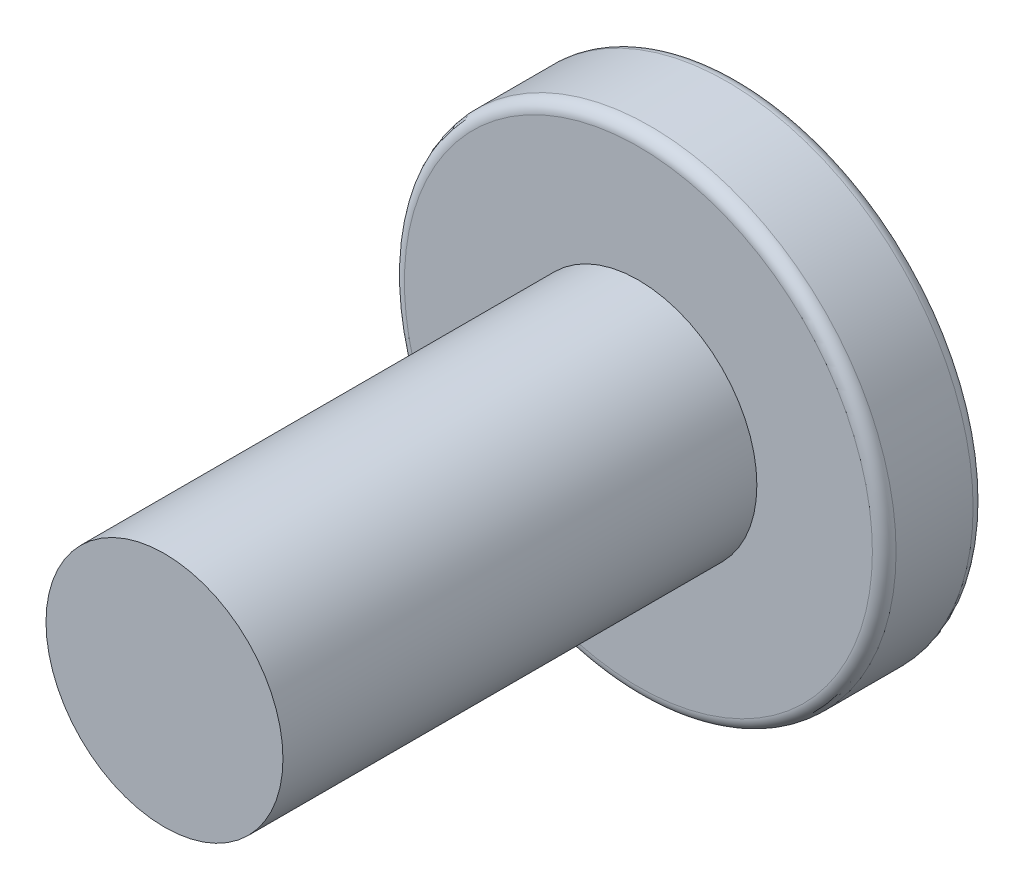
ISO-10303-21;
HEADER;
FILE_DESCRIPTION(('STEP AP214'),'2;1');
FILE_NAME('part.step','',(''),(''),'','','');
FILE_SCHEMA(('AUTOMOTIVE_DESIGN { 1 0 10303 214 1 1 1 1 }'));
ENDSEC;
DATA;
#1=APPLICATION_CONTEXT('core data for automotive mechanical design processes');
#2=APPLICATION_PROTOCOL_DEFINITION('international standard','automotive_design',2000,#1);
#3=PRODUCT_CONTEXT('',#1,'mechanical');
#4=PRODUCT('Part','Part','',(#3));
#5=PRODUCT_RELATED_PRODUCT_CATEGORY('part','',(#4));
#6=PRODUCT_DEFINITION_FORMATION('','',#4);
#7=PRODUCT_DEFINITION_CONTEXT('part definition',#1,'design');
#8=PRODUCT_DEFINITION('design','',#6,#7);
#9=PRODUCT_DEFINITION_SHAPE('','',#8);
#10=(LENGTH_UNIT() NAMED_UNIT(*) SI_UNIT(.MILLI.,.METRE.));
#11=(NAMED_UNIT(*) PLANE_ANGLE_UNIT() SI_UNIT($,.RADIAN.));
#12=(NAMED_UNIT(*) SI_UNIT($,.STERADIAN.) SOLID_ANGLE_UNIT());
#13=UNCERTAINTY_MEASURE_WITH_UNIT(LENGTH_MEASURE(1.E-05),#10,'distance_accuracy_value','');
#14=(GEOMETRIC_REPRESENTATION_CONTEXT(3) GLOBAL_UNCERTAINTY_ASSIGNED_CONTEXT((#13)) GLOBAL_UNIT_ASSIGNED_CONTEXT((#10,
#11,#12)) REPRESENTATION_CONTEXT('',''));
#15=CARTESIAN_POINT('',(0.,0.,0.));
#16=DIRECTION('',(0.,0.,1.));
#17=DIRECTION('',(1.,0.,0.));
#18=AXIS2_PLACEMENT_3D('',#15,#16,#17);
#19=CARTESIAN_POINT('',(0.,0.,1.7));
#20=DIRECTION('',(0.,0.,-1.));
#21=DIRECTION('',(-1.,0.,0.));
#22=AXIS2_PLACEMENT_3D('',#19,#20,#21);
#23=CYLINDRICAL_SURFACE('',#22,4.15);
#24=CARTESIAN_POINT('',(0.,0.,0.2));
#25=DIRECTION('',(0.,0.,1.));
#26=DIRECTION('',(1.,0.,0.));
#27=AXIS2_PLACEMENT_3D('',#24,#25,#26);
#28=CIRCLE('',#27,4.15);
#29=CARTESIAN_POINT('',(4.15,0.,0.2));
#30=VERTEX_POINT('',#29);
#31=EDGE_CURVE('E156',#30,#30,#28,.T.);
#32=ORIENTED_EDGE('',*,*,#31,.T.);
#33=EDGE_LOOP('',(#32));
#34=FACE_BOUND('',#33,.T.);
#35=CARTESIAN_POINT('',(0.,0.,1.5));
#36=DIRECTION('',(0.,0.,1.));
#37=DIRECTION('',(1.,0.,0.));
#38=AXIS2_PLACEMENT_3D('',#35,#36,#37);
#39=CIRCLE('',#38,4.15);
#40=CARTESIAN_POINT('',(4.15,0.,1.5));
#41=VERTEX_POINT('',#40);
#42=EDGE_CURVE('E153',#41,#41,#39,.F.);
#43=ORIENTED_EDGE('',*,*,#42,.T.);
#44=EDGE_LOOP('',(#43));
#45=FACE_BOUND('',#44,.T.);
#46=ADVANCED_FACE('F40',(#34,#45),#23,.T.);
#47=CARTESIAN_POINT('',(0.,0.,1.7));
#48=DIRECTION('',(0.,0.,1.));
#49=DIRECTION('',(1.,0.,0.));
#50=AXIS2_PLACEMENT_3D('',#47,#48,#49);
#51=PLANE('',#50);
#52=CARTESIAN_POINT('',(0.,0.,1.7));
#53=DIRECTION('',(0.,0.,1.));
#54=DIRECTION('',(1.,0.,0.));
#55=AXIS2_PLACEMENT_3D('',#52,#53,#54);
#56=CIRCLE('',#55,3.95);
#57=CARTESIAN_POINT('',(3.95,0.,1.7));
#58=VERTEX_POINT('',#57);
#59=EDGE_CURVE('E11',#58,#58,#56,.T.);
#60=ORIENTED_EDGE('',*,*,#59,.T.);
#61=EDGE_LOOP('',(#60));
#62=FACE_BOUND('',#61,.T.);
#63=CARTESIAN_POINT('',(0.,0.,1.7));
#64=DIRECTION('',(0.,0.,1.));
#65=DIRECTION('',(1.,0.,0.));
#66=AXIS2_PLACEMENT_3D('',#63,#64,#65);
#67=CIRCLE('',#66,2.);
#68=CARTESIAN_POINT('',(2.,0.,1.7));
#69=VERTEX_POINT('',#68);
#70=EDGE_CURVE('E150',#69,#69,#67,.T.);
#71=ORIENTED_EDGE('',*,*,#70,.F.);
#72=EDGE_LOOP('',(#71));
#73=FACE_BOUND('',#72,.T.);
#74=ADVANCED_FACE('F171',(#62,#73),#51,.T.);
#75=CARTESIAN_POINT('',(0.,0.,0.));
#76=DIRECTION('',(0.,0.,1.));
#77=DIRECTION('',(1.,0.,0.));
#78=AXIS2_PLACEMENT_3D('',#75,#76,#77);
#79=PLANE('',#78);
#80=DIRECTION('',(0.5,0.866025403784438,0.));
#81=VECTOR('',#80,1.);
#82=CARTESIAN_POINT('',(-1.15470053837925,0.,0.));
#83=LINE('',#82,#81);
#84=CARTESIAN_POINT('',(-1.15470053837925,0.,0.));
#85=VERTEX_POINT('',#84);
#86=CARTESIAN_POINT('',(-0.577350269189626,1.,0.));
#87=VERTEX_POINT('',#86);
#88=EDGE_CURVE('E129',#85,#87,#83,.T.);
#89=ORIENTED_EDGE('',*,*,#88,.F.);
#90=DIRECTION('',(-0.5,0.866025403784439,0.));
#91=VECTOR('',#90,1.);
#92=CARTESIAN_POINT('',(-0.577350269189626,-1.,0.));
#93=LINE('',#92,#91);
#94=CARTESIAN_POINT('',(-0.577350269189626,-1.,0.));
#95=VERTEX_POINT('',#94);
#96=EDGE_CURVE('E55',#95,#85,#93,.T.);
#97=ORIENTED_EDGE('',*,*,#96,.F.);
#98=DIRECTION('',(-1.,0.,0.));
#99=VECTOR('',#98,1.);
#100=CARTESIAN_POINT('',(0.577350269189626,-1.,0.));
#101=LINE('',#100,#99);
#102=CARTESIAN_POINT('',(0.577350269189626,-1.,0.));
#103=VERTEX_POINT('',#102);
#104=EDGE_CURVE('E138',#103,#95,#101,.T.);
#105=ORIENTED_EDGE('',*,*,#104,.F.);
#106=DIRECTION('',(-0.5,-0.866025403784438,0.));
#107=VECTOR('',#106,1.);
#108=CARTESIAN_POINT('',(1.15470053837925,0.,0.));
#109=LINE('',#108,#107);
#110=CARTESIAN_POINT('',(1.15470053837925,0.,0.));
#111=VERTEX_POINT('',#110);
#112=EDGE_CURVE('E136',#111,#103,#109,.T.);
#113=ORIENTED_EDGE('',*,*,#112,.F.);
#114=DIRECTION('',(0.5,-0.866025403784439,0.));
#115=VECTOR('',#114,1.);
#116=CARTESIAN_POINT('',(0.577350269189626,1.,0.));
#117=LINE('',#116,#115);
#118=CARTESIAN_POINT('',(0.577350269189626,1.,0.));
#119=VERTEX_POINT('',#118);
#120=EDGE_CURVE('E103',#119,#111,#117,.T.);
#121=ORIENTED_EDGE('',*,*,#120,.F.);
#122=DIRECTION('',(1.,0.,0.));
#123=VECTOR('',#122,1.);
#124=CARTESIAN_POINT('',(-0.577350269189626,1.,0.));
#125=LINE('',#124,#123);
#126=EDGE_CURVE('E132',#87,#119,#125,.T.);
#127=ORIENTED_EDGE('',*,*,#126,.F.);
#128=EDGE_LOOP('',(#89,#97,#105,#113,#121,#127));
#129=FACE_BOUND('',#128,.T.);
#130=CARTESIAN_POINT('',(0.,0.,0.));
#131=DIRECTION('',(0.,0.,1.));
#132=DIRECTION('',(1.,0.,0.));
#133=AXIS2_PLACEMENT_3D('',#130,#131,#132);
#134=CIRCLE('',#133,3.95);
#135=CARTESIAN_POINT('',(3.95,0.,0.));
#136=VERTEX_POINT('',#135);
#137=EDGE_CURVE('E48',#136,#136,#134,.F.);
#138=ORIENTED_EDGE('',*,*,#137,.T.);
#139=EDGE_LOOP('',(#138));
#140=FACE_BOUND('',#139,.T.);
#141=ADVANCED_FACE('F161',(#129,#140),#79,.F.);
#142=CARTESIAN_POINT('',(0.,0.,9.7));
#143=DIRECTION('',(0.,0.,-1.));
#144=DIRECTION('',(-1.,0.,0.));
#145=AXIS2_PLACEMENT_3D('',#142,#143,#144);
#146=CYLINDRICAL_SURFACE('',#145,2.);
#147=CARTESIAN_POINT('',(0.,0.,9.7));
#148=DIRECTION('',(0.,0.,1.));
#149=DIRECTION('',(1.,0.,0.));
#150=AXIS2_PLACEMENT_3D('',#147,#148,#149);
#151=CIRCLE('',#150,2.);
#152=CARTESIAN_POINT('',(2.,0.,9.7));
#153=VERTEX_POINT('',#152);
#154=EDGE_CURVE('E142',#153,#153,#151,.T.);
#155=ORIENTED_EDGE('',*,*,#154,.F.);
#156=EDGE_LOOP('',(#155));
#157=FACE_BOUND('',#156,.T.);
#158=ORIENTED_EDGE('',*,*,#70,.T.);
#159=EDGE_LOOP('',(#158));
#160=FACE_BOUND('',#159,.T.);
#161=ADVANCED_FACE('F185',(#157,#160),#146,.T.);
#162=CARTESIAN_POINT('',(0.,0.,9.7));
#163=DIRECTION('',(0.,0.,1.));
#164=DIRECTION('',(1.,0.,0.));
#165=AXIS2_PLACEMENT_3D('',#162,#163,#164);
#166=PLANE('',#165);
#167=ORIENTED_EDGE('',*,*,#154,.T.);
#168=EDGE_LOOP('',(#167));
#169=FACE_BOUND('',#168,.T.);
#170=ADVANCED_FACE('F166',(#169),#166,.T.);
#171=CARTESIAN_POINT('',(0.,0.,0.2));
#172=DIRECTION('',(0.,0.,1.));
#173=DIRECTION('',(1.,0.,0.));
#174=AXIS2_PLACEMENT_3D('',#171,#172,#173);
#175=TOROIDAL_SURFACE('',#174,3.95,0.2);
#176=ORIENTED_EDGE('',*,*,#137,.F.);
#177=EDGE_LOOP('',(#176));
#178=FACE_BOUND('',#177,.T.);
#179=ORIENTED_EDGE('',*,*,#31,.F.);
#180=EDGE_LOOP('',(#179));
#181=FACE_BOUND('',#180,.T.);
#182=ADVANCED_FACE('F163',(#178,#181),#175,.T.);
#183=CARTESIAN_POINT('',(0.,0.,1.5));
#184=DIRECTION('',(0.,0.,1.));
#185=DIRECTION('',(1.,0.,0.));
#186=AXIS2_PLACEMENT_3D('',#183,#184,#185);
#187=TOROIDAL_SURFACE('',#186,3.95,0.2);
#188=ORIENTED_EDGE('',*,*,#42,.F.);
#189=EDGE_LOOP('',(#188));
#190=FACE_BOUND('',#189,.T.);
#191=ORIENTED_EDGE('',*,*,#59,.F.);
#192=EDGE_LOOP('',(#191));
#193=FACE_BOUND('',#192,.T.);
#194=ADVANCED_FACE('F42',(#190,#193),#187,.T.);
#195=CARTESIAN_POINT('',(-0.577350269189626,-1.,1.5));
#196=DIRECTION('',(-0.866025403784439,-0.5,0.));
#197=DIRECTION('',(0.5,-0.866025403784439,0.));
#198=AXIS2_PLACEMENT_3D('',#195,#196,#197);
#199=PLANE('',#198);
#200=ORIENTED_EDGE('',*,*,#96,.T.);
#201=DIRECTION('',(0.,0.,-1.));
#202=VECTOR('',#201,1.);
#203=CARTESIAN_POINT('',(-1.15470053837925,0.,1.5));
#204=LINE('',#203,#202);
#205=CARTESIAN_POINT('',(-1.15470053837925,0.,1.5));
#206=VERTEX_POINT('',#205);
#207=EDGE_CURVE('E85',#206,#85,#204,.T.);
#208=ORIENTED_EDGE('',*,*,#207,.F.);
#209=DIRECTION('',(-0.5,0.866025403784439,0.));
#210=VECTOR('',#209,1.);
#211=CARTESIAN_POINT('',(-0.577350269189626,-1.,1.5));
#212=LINE('',#211,#210);
#213=CARTESIAN_POINT('',(-0.577350269189626,-1.,1.5));
#214=VERTEX_POINT('',#213);
#215=EDGE_CURVE('E140',#214,#206,#212,.T.);
#216=ORIENTED_EDGE('',*,*,#215,.F.);
#217=DIRECTION('',(0.,0.,-1.));
#218=VECTOR('',#217,1.);
#219=CARTESIAN_POINT('',(-0.577350269189626,-1.,1.5));
#220=LINE('',#219,#218);
#221=EDGE_CURVE('E63',#214,#95,#220,.T.);
#222=ORIENTED_EDGE('',*,*,#221,.T.);
#223=EDGE_LOOP('',(#200,#208,#216,#222));
#224=FACE_BOUND('',#223,.T.);
#225=ADVANCED_FACE('F177',(#224),#199,.F.);
#226=CARTESIAN_POINT('',(0.577350269189626,-1.,1.5));
#227=DIRECTION('',(0.,-1.,0.));
#228=DIRECTION('',(0.,0.,-1.));
#229=AXIS2_PLACEMENT_3D('',#226,#227,#228);
#230=PLANE('',#229);
#231=ORIENTED_EDGE('',*,*,#104,.T.);
#232=ORIENTED_EDGE('',*,*,#221,.F.);
#233=DIRECTION('',(-1.,0.,0.));
#234=VECTOR('',#233,1.);
#235=CARTESIAN_POINT('',(0.577350269189626,-1.,1.5));
#236=LINE('',#235,#234);
#237=CARTESIAN_POINT('',(0.577350269189626,-1.,1.5));
#238=VERTEX_POINT('',#237);
#239=EDGE_CURVE('E115',#238,#214,#236,.T.);
#240=ORIENTED_EDGE('',*,*,#239,.F.);
#241=DIRECTION('',(0.,0.,-1.));
#242=VECTOR('',#241,1.);
#243=CARTESIAN_POINT('',(0.577350269189626,-1.,1.5));
#244=LINE('',#243,#242);
#245=EDGE_CURVE('E107',#238,#103,#244,.T.);
#246=ORIENTED_EDGE('',*,*,#245,.T.);
#247=EDGE_LOOP('',(#231,#232,#240,#246));
#248=FACE_BOUND('',#247,.T.);
#249=ADVANCED_FACE('F201',(#248),#230,.F.);
#250=CARTESIAN_POINT('',(1.15470053837925,0.,1.5));
#251=DIRECTION('',(0.866025403784439,-0.5,0.));
#252=DIRECTION('',(0.5,0.866025403784439,0.));
#253=AXIS2_PLACEMENT_3D('',#250,#251,#252);
#254=PLANE('',#253);
#255=ORIENTED_EDGE('',*,*,#112,.T.);
#256=ORIENTED_EDGE('',*,*,#245,.F.);
#257=DIRECTION('',(-0.5,-0.866025403784438,0.));
#258=VECTOR('',#257,1.);
#259=CARTESIAN_POINT('',(1.15470053837925,0.,1.5));
#260=LINE('',#259,#258);
#261=CARTESIAN_POINT('',(1.15470053837925,0.,1.5));
#262=VERTEX_POINT('',#261);
#263=EDGE_CURVE('E111',#262,#238,#260,.T.);
#264=ORIENTED_EDGE('',*,*,#263,.F.);
#265=DIRECTION('',(0.,0.,-1.));
#266=VECTOR('',#265,1.);
#267=CARTESIAN_POINT('',(1.15470053837925,0.,1.5));
#268=LINE('',#267,#266);
#269=EDGE_CURVE('E96',#262,#111,#268,.T.);
#270=ORIENTED_EDGE('',*,*,#269,.T.);
#271=EDGE_LOOP('',(#255,#256,#264,#270));
#272=FACE_BOUND('',#271,.T.);
#273=ADVANCED_FACE('F112',(#272),#254,.F.);
#274=CARTESIAN_POINT('',(0.577350269189626,1.,1.5));
#275=DIRECTION('',(0.866025403784439,0.5,0.));
#276=DIRECTION('',(-0.5,0.866025403784439,0.));
#277=AXIS2_PLACEMENT_3D('',#274,#275,#276);
#278=PLANE('',#277);
#279=ORIENTED_EDGE('',*,*,#120,.T.);
#280=ORIENTED_EDGE('',*,*,#269,.F.);
#281=DIRECTION('',(0.5,-0.866025403784439,0.));
#282=VECTOR('',#281,1.);
#283=CARTESIAN_POINT('',(0.577350269189626,1.,1.5));
#284=LINE('',#283,#282);
#285=CARTESIAN_POINT('',(0.577350269189626,1.,1.5));
#286=VERTEX_POINT('',#285);
#287=EDGE_CURVE('E100',#286,#262,#284,.T.);
#288=ORIENTED_EDGE('',*,*,#287,.F.);
#289=DIRECTION('',(0.,0.,-1.));
#290=VECTOR('',#289,1.);
#291=CARTESIAN_POINT('',(0.577350269189626,1.,1.5));
#292=LINE('',#291,#290);
#293=EDGE_CURVE('E108',#286,#119,#292,.T.);
#294=ORIENTED_EDGE('',*,*,#293,.T.);
#295=EDGE_LOOP('',(#279,#280,#288,#294));
#296=FACE_BOUND('',#295,.T.);
#297=ADVANCED_FACE('F98',(#296),#278,.F.);
#298=CARTESIAN_POINT('',(-0.577350269189626,1.,1.5));
#299=DIRECTION('',(0.,1.,0.));
#300=DIRECTION('',(0.,0.,1.));
#301=AXIS2_PLACEMENT_3D('',#298,#299,#300);
#302=PLANE('',#301);
#303=ORIENTED_EDGE('',*,*,#126,.T.);
#304=ORIENTED_EDGE('',*,*,#293,.F.);
#305=DIRECTION('',(1.,0.,0.));
#306=VECTOR('',#305,1.);
#307=CARTESIAN_POINT('',(-0.577350269189626,1.,1.5));
#308=LINE('',#307,#306);
#309=CARTESIAN_POINT('',(-0.577350269189626,1.,1.5));
#310=VERTEX_POINT('',#309);
#311=EDGE_CURVE('E121',#310,#286,#308,.T.);
#312=ORIENTED_EDGE('',*,*,#311,.F.);
#313=DIRECTION('',(0.,0.,-1.));
#314=VECTOR('',#313,1.);
#315=CARTESIAN_POINT('',(-0.577350269189626,1.,1.5));
#316=LINE('',#315,#314);
#317=EDGE_CURVE('E145',#310,#87,#316,.T.);
#318=ORIENTED_EDGE('',*,*,#317,.T.);
#319=EDGE_LOOP('',(#303,#304,#312,#318));
#320=FACE_BOUND('',#319,.T.);
#321=ADVANCED_FACE('F205',(#320),#302,.F.);
#322=CARTESIAN_POINT('',(-1.15470053837925,0.,1.5));
#323=DIRECTION('',(-0.866025403784439,0.5,0.));
#324=DIRECTION('',(-0.5,-0.866025403784439,0.));
#325=AXIS2_PLACEMENT_3D('',#322,#323,#324);
#326=PLANE('',#325);
#327=ORIENTED_EDGE('',*,*,#88,.T.);
#328=ORIENTED_EDGE('',*,*,#317,.F.);
#329=DIRECTION('',(0.5,0.866025403784438,0.));
#330=VECTOR('',#329,1.);
#331=CARTESIAN_POINT('',(-1.15470053837925,0.,1.5));
#332=LINE('',#331,#330);
#333=EDGE_CURVE('E123',#206,#310,#332,.T.);
#334=ORIENTED_EDGE('',*,*,#333,.F.);
#335=ORIENTED_EDGE('',*,*,#207,.T.);
#336=EDGE_LOOP('',(#327,#328,#334,#335));
#337=FACE_BOUND('',#336,.T.);
#338=ADVANCED_FACE('F202',(#337),#326,.F.);
#339=CARTESIAN_POINT('',(0.,0.,1.5));
#340=DIRECTION('',(0.,0.,-1.));
#341=DIRECTION('',(-1.,0.,0.));
#342=AXIS2_PLACEMENT_3D('',#339,#340,#341);
#343=PLANE('',#342);
#344=ORIENTED_EDGE('',*,*,#215,.T.);
#345=ORIENTED_EDGE('',*,*,#333,.T.);
#346=ORIENTED_EDGE('',*,*,#311,.T.);
#347=ORIENTED_EDGE('',*,*,#287,.T.);
#348=ORIENTED_EDGE('',*,*,#263,.T.);
#349=ORIENTED_EDGE('',*,*,#239,.T.);
#350=EDGE_LOOP('',(#344,#345,#346,#347,#348,#349));
#351=FACE_BOUND('',#350,.T.);
#352=ADVANCED_FACE('F118',(#351),#343,.T.);
#353=CLOSED_SHELL('',(#46,#74,#141,#161,#170,#182,#194,#225,#249,#273,#297,#321,#338,#352));
#354=MANIFOLD_SOLID_BREP('B2',#353);
#355=ADVANCED_BREP_SHAPE_REPRESENTATION('',(#18,#354),#14);
#356=SHAPE_DEFINITION_REPRESENTATION(#9,#355);
ENDSEC;
END-ISO-10303-21;
